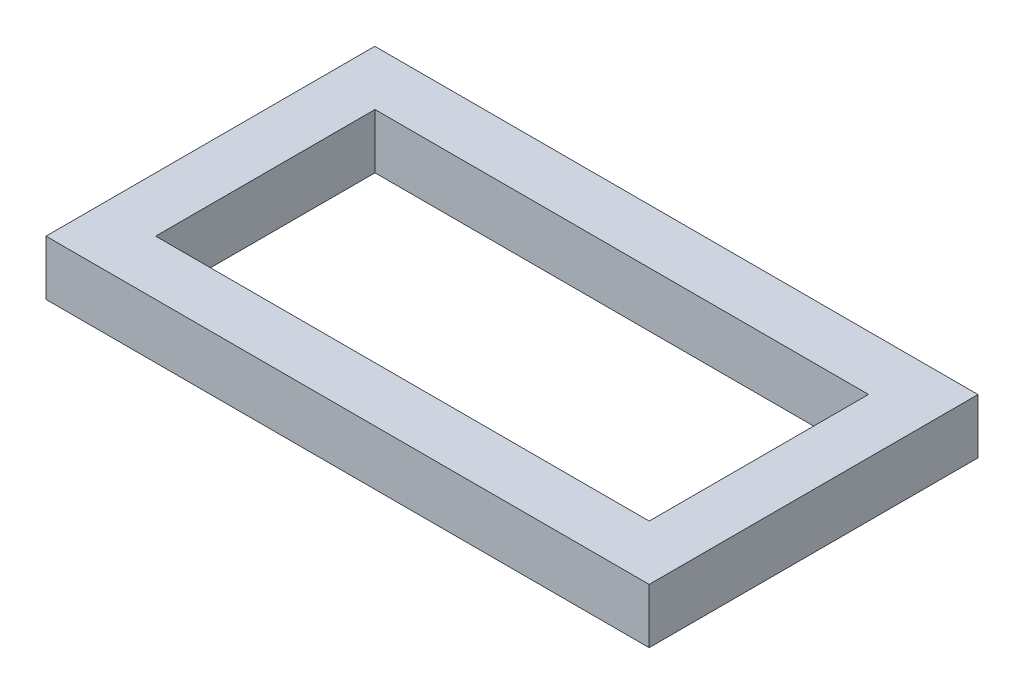
ISO-10303-21;
HEADER;
FILE_DESCRIPTION(('STEP AP214'),'2;1');
FILE_NAME('part.step','',(''),(''),'','','');
FILE_SCHEMA(('AUTOMOTIVE_DESIGN { 1 0 10303 214 1 1 1 1 }'));
ENDSEC;
DATA;
#1=APPLICATION_CONTEXT('core data for automotive mechanical design processes');
#2=APPLICATION_PROTOCOL_DEFINITION('international standard','automotive_design',2000,#1);
#3=PRODUCT_CONTEXT('',#1,'mechanical');
#4=PRODUCT('Part','Part','',(#3));
#5=PRODUCT_RELATED_PRODUCT_CATEGORY('part','',(#4));
#6=PRODUCT_DEFINITION_FORMATION('','',#4);
#7=PRODUCT_DEFINITION_CONTEXT('part definition',#1,'design');
#8=PRODUCT_DEFINITION('design','',#6,#7);
#9=PRODUCT_DEFINITION_SHAPE('','',#8);
#10=(LENGTH_UNIT() NAMED_UNIT(*) SI_UNIT(.MILLI.,.METRE.));
#11=(NAMED_UNIT(*) PLANE_ANGLE_UNIT() SI_UNIT($,.RADIAN.));
#12=(NAMED_UNIT(*) SI_UNIT($,.STERADIAN.) SOLID_ANGLE_UNIT());
#13=UNCERTAINTY_MEASURE_WITH_UNIT(LENGTH_MEASURE(1.E-05),#10,'distance_accuracy_value','');
#14=(GEOMETRIC_REPRESENTATION_CONTEXT(3) GLOBAL_UNCERTAINTY_ASSIGNED_CONTEXT((#13)) GLOBAL_UNIT_ASSIGNED_CONTEXT((#10,
#11,#12)) REPRESENTATION_CONTEXT('',''));
#15=CARTESIAN_POINT('',(0.,0.,0.));
#16=DIRECTION('',(0.,0.,1.));
#17=DIRECTION('',(1.,0.,0.));
#18=AXIS2_PLACEMENT_3D('',#15,#16,#17);
#19=CARTESIAN_POINT('',(-110.,-20.,60.));
#20=DIRECTION('',(0.,0.,1.));
#21=DIRECTION('',(1.,0.,0.));
#22=AXIS2_PLACEMENT_3D('',#19,#20,#21);
#23=PLANE('',#22);
#24=DIRECTION('',(1.,0.,0.));
#25=VECTOR('',#24,1.);
#26=CARTESIAN_POINT('',(-110.,0.,60.));
#27=LINE('',#26,#25);
#28=CARTESIAN_POINT('',(-110.,0.,60.));
#29=VERTEX_POINT('',#28);
#30=CARTESIAN_POINT('',(110.,0.,60.));
#31=VERTEX_POINT('',#30);
#32=EDGE_CURVE('E160',#29,#31,#27,.T.);
#33=ORIENTED_EDGE('',*,*,#32,.F.);
#34=DIRECTION('',(0.,1.,0.));
#35=VECTOR('',#34,1.);
#36=CARTESIAN_POINT('',(-110.,-20.,60.));
#37=LINE('',#36,#35);
#38=CARTESIAN_POINT('',(-110.,-20.,60.));
#39=VERTEX_POINT('',#38);
#40=EDGE_CURVE('E49',#39,#29,#37,.T.);
#41=ORIENTED_EDGE('',*,*,#40,.F.);
#42=DIRECTION('',(1.,0.,0.));
#43=VECTOR('',#42,1.);
#44=CARTESIAN_POINT('',(-110.,-20.,60.));
#45=LINE('',#44,#43);
#46=CARTESIAN_POINT('',(110.,-20.,60.));
#47=VERTEX_POINT('',#46);
#48=EDGE_CURVE('E167',#39,#47,#45,.T.);
#49=ORIENTED_EDGE('',*,*,#48,.T.);
#50=DIRECTION('',(0.,1.,0.));
#51=VECTOR('',#50,1.);
#52=CARTESIAN_POINT('',(110.,-20.,60.));
#53=LINE('',#52,#51);
#54=EDGE_CURVE('E11',#47,#31,#53,.T.);
#55=ORIENTED_EDGE('',*,*,#54,.T.);
#56=EDGE_LOOP('',(#33,#41,#49,#55));
#57=FACE_BOUND('',#56,.T.);
#58=ADVANCED_FACE('F39',(#57),#23,.T.);
#59=CARTESIAN_POINT('',(-110.,-20.,40.));
#60=DIRECTION('',(-1.,0.,0.));
#61=DIRECTION('',(0.,0.,1.));
#62=AXIS2_PLACEMENT_3D('',#59,#60,#61);
#63=PLANE('',#62);
#64=DIRECTION('',(0.,0.,1.));
#65=VECTOR('',#64,1.);
#66=CARTESIAN_POINT('',(-110.,0.,40.));
#67=LINE('',#66,#65);
#68=CARTESIAN_POINT('',(-110.,0.,-59.9317164833402));
#69=VERTEX_POINT('',#68);
#70=EDGE_CURVE('E178',#69,#29,#67,.T.);
#71=ORIENTED_EDGE('',*,*,#70,.F.);
#72=DIRECTION('',(0.,1.,0.));
#73=VECTOR('',#72,1.);
#74=CARTESIAN_POINT('',(-110.,-20.,-59.9317164833402));
#75=LINE('',#74,#73);
#76=CARTESIAN_POINT('',(-110.,-20.,-59.9317164833402));
#77=VERTEX_POINT('',#76);
#78=EDGE_CURVE('E186',#77,#69,#75,.T.);
#79=ORIENTED_EDGE('',*,*,#78,.F.);
#80=DIRECTION('',(0.,0.,1.));
#81=VECTOR('',#80,1.);
#82=CARTESIAN_POINT('',(-110.,-20.,-59.9317164833402));
#83=LINE('',#82,#81);
#84=EDGE_CURVE('E164',#77,#39,#83,.T.);
#85=ORIENTED_EDGE('',*,*,#84,.T.);
#86=ORIENTED_EDGE('',*,*,#40,.T.);
#87=EDGE_LOOP('',(#71,#79,#85,#86));
#88=FACE_BOUND('',#87,.T.);
#89=ADVANCED_FACE('F205',(#88),#63,.T.);
#90=CARTESIAN_POINT('',(-110.,-20.,-59.9317164833402));
#91=DIRECTION('',(0.,0.,-1.));
#92=DIRECTION('',(-1.,0.,0.));
#93=AXIS2_PLACEMENT_3D('',#90,#91,#92);
#94=PLANE('',#93);
#95=DIRECTION('',(-1.,0.,0.));
#96=VECTOR('',#95,1.);
#97=CARTESIAN_POINT('',(-110.,0.,-59.9317164833402));
#98=LINE('',#97,#96);
#99=CARTESIAN_POINT('',(110.,0.,-59.9317164833402));
#100=VERTEX_POINT('',#99);
#101=EDGE_CURVE('E174',#100,#69,#98,.T.);
#102=ORIENTED_EDGE('',*,*,#101,.F.);
#103=DIRECTION('',(0.,1.,0.));
#104=VECTOR('',#103,1.);
#105=CARTESIAN_POINT('',(110.,-20.,-59.9317164833402));
#106=LINE('',#105,#104);
#107=CARTESIAN_POINT('',(110.,-20.,-59.9317164833402));
#108=VERTEX_POINT('',#107);
#109=EDGE_CURVE('E43',#108,#100,#106,.T.);
#110=ORIENTED_EDGE('',*,*,#109,.F.);
#111=DIRECTION('',(-1.,0.,0.));
#112=VECTOR('',#111,1.);
#113=CARTESIAN_POINT('',(-110.,-20.,-59.9317164833402));
#114=LINE('',#113,#112);
#115=EDGE_CURVE('E159',#108,#77,#114,.T.);
#116=ORIENTED_EDGE('',*,*,#115,.T.);
#117=ORIENTED_EDGE('',*,*,#78,.T.);
#118=EDGE_LOOP('',(#102,#110,#116,#117));
#119=FACE_BOUND('',#118,.T.);
#120=ADVANCED_FACE('F196',(#119),#94,.T.);
#121=CARTESIAN_POINT('',(110.,-20.,-59.9317164833402));
#122=DIRECTION('',(1.,0.,0.));
#123=DIRECTION('',(0.,0.,-1.));
#124=AXIS2_PLACEMENT_3D('',#121,#122,#123);
#125=PLANE('',#124);
#126=DIRECTION('',(0.,0.,-1.));
#127=VECTOR('',#126,1.);
#128=CARTESIAN_POINT('',(110.,0.,-59.9317164833402));
#129=LINE('',#128,#127);
#130=EDGE_CURVE('E150',#31,#100,#129,.T.);
#131=ORIENTED_EDGE('',*,*,#130,.F.);
#132=ORIENTED_EDGE('',*,*,#54,.F.);
#133=DIRECTION('',(0.,0.,-1.));
#134=VECTOR('',#133,1.);
#135=CARTESIAN_POINT('',(110.,-20.,40.));
#136=LINE('',#135,#134);
#137=EDGE_CURVE('E156',#47,#108,#136,.T.);
#138=ORIENTED_EDGE('',*,*,#137,.T.);
#139=ORIENTED_EDGE('',*,*,#109,.T.);
#140=EDGE_LOOP('',(#131,#132,#138,#139));
#141=FACE_BOUND('',#140,.T.);
#142=ADVANCED_FACE('F41',(#141),#125,.T.);
#143=CARTESIAN_POINT('',(0.,-20.,0.));
#144=DIRECTION('',(0.,1.,0.));
#145=DIRECTION('',(0.,0.,1.));
#146=AXIS2_PLACEMENT_3D('',#143,#144,#145);
#147=PLANE('',#146);
#148=DIRECTION('',(0.,0.,1.));
#149=VECTOR('',#148,1.);
#150=CARTESIAN_POINT('',(-90.,-20.,-40.));
#151=LINE('',#150,#149);
#152=CARTESIAN_POINT('',(-90.,-20.,-40.));
#153=VERTEX_POINT('',#152);
#154=CARTESIAN_POINT('',(-90.,-20.,40.));
#155=VERTEX_POINT('',#154);
#156=EDGE_CURVE('E116',#153,#155,#151,.T.);
#157=ORIENTED_EDGE('',*,*,#156,.T.);
#158=DIRECTION('',(1.,0.,0.));
#159=VECTOR('',#158,1.);
#160=CARTESIAN_POINT('',(-90.,-20.,40.));
#161=LINE('',#160,#159);
#162=CARTESIAN_POINT('',(90.,-20.,40.));
#163=VERTEX_POINT('',#162);
#164=EDGE_CURVE('E109',#155,#163,#161,.T.);
#165=ORIENTED_EDGE('',*,*,#164,.T.);
#166=DIRECTION('',(0.,0.,-1.));
#167=VECTOR('',#166,1.);
#168=CARTESIAN_POINT('',(90.,-20.,-40.));
#169=LINE('',#168,#167);
#170=CARTESIAN_POINT('',(90.,-20.,-40.));
#171=VERTEX_POINT('',#170);
#172=EDGE_CURVE('E119',#163,#171,#169,.T.);
#173=ORIENTED_EDGE('',*,*,#172,.T.);
#174=DIRECTION('',(-1.,0.,0.));
#175=VECTOR('',#174,1.);
#176=CARTESIAN_POINT('',(-90.,-20.,-40.));
#177=LINE('',#176,#175);
#178=EDGE_CURVE('E57',#171,#153,#177,.T.);
#179=ORIENTED_EDGE('',*,*,#178,.T.);
#180=EDGE_LOOP('',(#157,#165,#173,#179));
#181=FACE_BOUND('',#180,.T.);
#182=ORIENTED_EDGE('',*,*,#137,.F.);
#183=ORIENTED_EDGE('',*,*,#48,.F.);
#184=ORIENTED_EDGE('',*,*,#84,.F.);
#185=ORIENTED_EDGE('',*,*,#115,.F.);
#186=EDGE_LOOP('',(#182,#183,#184,#185));
#187=FACE_BOUND('',#186,.T.);
#188=ADVANCED_FACE('F124',(#181,#187),#147,.F.);
#189=CARTESIAN_POINT('',(0.,0.,0.));
#190=DIRECTION('',(0.,1.,0.));
#191=DIRECTION('',(0.,0.,1.));
#192=AXIS2_PLACEMENT_3D('',#189,#190,#191);
#193=PLANE('',#192);
#194=DIRECTION('',(1.,0.,0.));
#195=VECTOR('',#194,1.);
#196=CARTESIAN_POINT('',(-90.,0.,40.));
#197=LINE('',#196,#195);
#198=CARTESIAN_POINT('',(-90.,0.,40.));
#199=VERTEX_POINT('',#198);
#200=CARTESIAN_POINT('',(90.,0.,40.));
#201=VERTEX_POINT('',#200);
#202=EDGE_CURVE('E65',#199,#201,#197,.T.);
#203=ORIENTED_EDGE('',*,*,#202,.F.);
#204=DIRECTION('',(0.,0.,1.));
#205=VECTOR('',#204,1.);
#206=CARTESIAN_POINT('',(-90.,0.,-40.));
#207=LINE('',#206,#205);
#208=CARTESIAN_POINT('',(-90.,0.,-40.));
#209=VERTEX_POINT('',#208);
#210=EDGE_CURVE('E128',#209,#199,#207,.T.);
#211=ORIENTED_EDGE('',*,*,#210,.F.);
#212=DIRECTION('',(-1.,0.,0.));
#213=VECTOR('',#212,1.);
#214=CARTESIAN_POINT('',(-90.,0.,-40.));
#215=LINE('',#214,#213);
#216=CARTESIAN_POINT('',(90.,0.,-40.));
#217=VERTEX_POINT('',#216);
#218=EDGE_CURVE('E132',#217,#209,#215,.T.);
#219=ORIENTED_EDGE('',*,*,#218,.F.);
#220=DIRECTION('',(0.,0.,-1.));
#221=VECTOR('',#220,1.);
#222=CARTESIAN_POINT('',(90.,0.,-40.));
#223=LINE('',#222,#221);
#224=EDGE_CURVE('E141',#201,#217,#223,.T.);
#225=ORIENTED_EDGE('',*,*,#224,.F.);
#226=EDGE_LOOP('',(#203,#211,#219,#225));
#227=FACE_BOUND('',#226,.T.);
#228=ORIENTED_EDGE('',*,*,#32,.T.);
#229=ORIENTED_EDGE('',*,*,#130,.T.);
#230=ORIENTED_EDGE('',*,*,#101,.T.);
#231=ORIENTED_EDGE('',*,*,#70,.T.);
#232=EDGE_LOOP('',(#228,#229,#230,#231));
#233=FACE_BOUND('',#232,.T.);
#234=ADVANCED_FACE('F198',(#227,#233),#193,.T.);
#235=CARTESIAN_POINT('',(-90.,-20.,40.));
#236=DIRECTION('',(0.,0.,1.));
#237=DIRECTION('',(1.,0.,0.));
#238=AXIS2_PLACEMENT_3D('',#235,#236,#237);
#239=PLANE('',#238);
#240=ORIENTED_EDGE('',*,*,#202,.T.);
#241=DIRECTION('',(0.,1.,0.));
#242=VECTOR('',#241,1.);
#243=CARTESIAN_POINT('',(90.,-20.,40.));
#244=LINE('',#243,#242);
#245=EDGE_CURVE('E105',#163,#201,#244,.T.);
#246=ORIENTED_EDGE('',*,*,#245,.F.);
#247=ORIENTED_EDGE('',*,*,#164,.F.);
#248=DIRECTION('',(0.,1.,0.));
#249=VECTOR('',#248,1.);
#250=CARTESIAN_POINT('',(-90.,-20.,40.));
#251=LINE('',#250,#249);
#252=EDGE_CURVE('E147',#155,#199,#251,.T.);
#253=ORIENTED_EDGE('',*,*,#252,.T.);
#254=EDGE_LOOP('',(#240,#246,#247,#253));
#255=FACE_BOUND('',#254,.T.);
#256=ADVANCED_FACE('F107',(#255),#239,.F.);
#257=CARTESIAN_POINT('',(-90.,-20.,-40.));
#258=DIRECTION('',(-1.,0.,0.));
#259=DIRECTION('',(0.,0.,1.));
#260=AXIS2_PLACEMENT_3D('',#257,#258,#259);
#261=PLANE('',#260);
#262=ORIENTED_EDGE('',*,*,#210,.T.);
#263=ORIENTED_EDGE('',*,*,#252,.F.);
#264=ORIENTED_EDGE('',*,*,#156,.F.);
#265=DIRECTION('',(0.,1.,0.));
#266=VECTOR('',#265,1.);
#267=CARTESIAN_POINT('',(-90.,-20.,-40.));
#268=LINE('',#267,#266);
#269=EDGE_CURVE('E151',#153,#209,#268,.T.);
#270=ORIENTED_EDGE('',*,*,#269,.T.);
#271=EDGE_LOOP('',(#262,#263,#264,#270));
#272=FACE_BOUND('',#271,.T.);
#273=ADVANCED_FACE('F221',(#272),#261,.F.);
#274=CARTESIAN_POINT('',(-90.,-20.,-40.));
#275=DIRECTION('',(0.,0.,-1.));
#276=DIRECTION('',(-1.,0.,0.));
#277=AXIS2_PLACEMENT_3D('',#274,#275,#276);
#278=PLANE('',#277);
#279=ORIENTED_EDGE('',*,*,#218,.T.);
#280=ORIENTED_EDGE('',*,*,#269,.F.);
#281=ORIENTED_EDGE('',*,*,#178,.F.);
#282=DIRECTION('',(0.,1.,0.));
#283=VECTOR('',#282,1.);
#284=CARTESIAN_POINT('',(90.,-20.,-40.));
#285=LINE('',#284,#283);
#286=EDGE_CURVE('E115',#171,#217,#285,.T.);
#287=ORIENTED_EDGE('',*,*,#286,.T.);
#288=EDGE_LOOP('',(#279,#280,#281,#287));
#289=FACE_BOUND('',#288,.T.);
#290=ADVANCED_FACE('F224',(#289),#278,.F.);
#291=CARTESIAN_POINT('',(90.,-20.,-40.));
#292=DIRECTION('',(1.,0.,0.));
#293=DIRECTION('',(0.,0.,-1.));
#294=AXIS2_PLACEMENT_3D('',#291,#292,#293);
#295=PLANE('',#294);
#296=ORIENTED_EDGE('',*,*,#224,.T.);
#297=ORIENTED_EDGE('',*,*,#286,.F.);
#298=ORIENTED_EDGE('',*,*,#172,.F.);
#299=ORIENTED_EDGE('',*,*,#245,.T.);
#300=EDGE_LOOP('',(#296,#297,#298,#299));
#301=FACE_BOUND('',#300,.T.);
#302=ADVANCED_FACE('F120',(#301),#295,.F.);
#303=CLOSED_SHELL('',(#58,#89,#120,#142,#188,#234,#256,#273,#290,#302));
#304=MANIFOLD_SOLID_BREP('B2',#303);
#305=ADVANCED_BREP_SHAPE_REPRESENTATION('',(#18,#304),#14);
#306=SHAPE_DEFINITION_REPRESENTATION(#9,#305);
ENDSEC;
END-ISO-10303-21;
